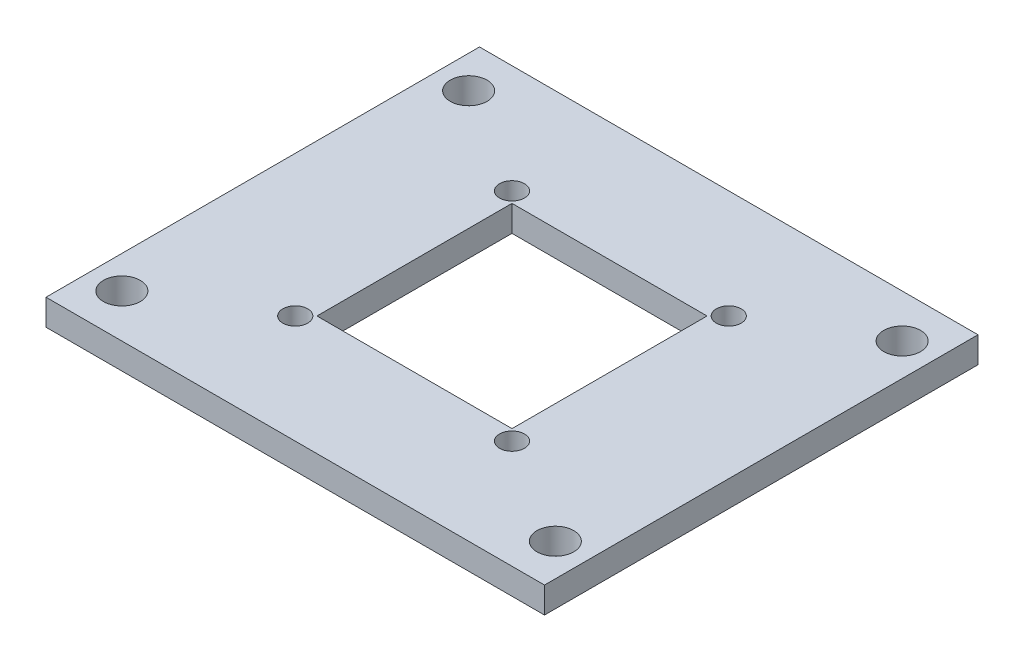
ISO-10303-21;
HEADER;
FILE_DESCRIPTION(('STEP AP214'),'2;1');
FILE_NAME('part.step','',(''),(''),'','','');
FILE_SCHEMA(('AUTOMOTIVE_DESIGN { 1 0 10303 214 1 1 1 1 }'));
ENDSEC;
DATA;
#1=APPLICATION_CONTEXT('core data for automotive mechanical design processes');
#2=APPLICATION_PROTOCOL_DEFINITION('international standard','automotive_design',2000,#1);
#3=PRODUCT_CONTEXT('',#1,'mechanical');
#4=PRODUCT('Part','Part','',(#3));
#5=PRODUCT_RELATED_PRODUCT_CATEGORY('part','',(#4));
#6=PRODUCT_DEFINITION_FORMATION('','',#4);
#7=PRODUCT_DEFINITION_CONTEXT('part definition',#1,'design');
#8=PRODUCT_DEFINITION('design','',#6,#7);
#9=PRODUCT_DEFINITION_SHAPE('','',#8);
#10=(LENGTH_UNIT() NAMED_UNIT(*) SI_UNIT(.MILLI.,.METRE.));
#11=(NAMED_UNIT(*) PLANE_ANGLE_UNIT() SI_UNIT($,.RADIAN.));
#12=(NAMED_UNIT(*) SI_UNIT($,.STERADIAN.) SOLID_ANGLE_UNIT());
#13=UNCERTAINTY_MEASURE_WITH_UNIT(LENGTH_MEASURE(1.E-05),#10,'distance_accuracy_value','');
#14=(GEOMETRIC_REPRESENTATION_CONTEXT(3) GLOBAL_UNCERTAINTY_ASSIGNED_CONTEXT((#13)) GLOBAL_UNIT_ASSIGNED_CONTEXT((#10,
#11,#12)) REPRESENTATION_CONTEXT('',''));
#15=CARTESIAN_POINT('',(0.,0.,0.));
#16=DIRECTION('',(0.,0.,1.));
#17=DIRECTION('',(1.,0.,0.));
#18=AXIS2_PLACEMENT_3D('',#15,#16,#17);
#19=CARTESIAN_POINT('',(20.,-20.,-17.));
#20=DIRECTION('',(0.,1.,0.));
#21=DIRECTION('',(1.,0.,0.));
#22=AXIS2_PLACEMENT_3D('',#19,#20,#21);
#23=CYLINDRICAL_SURFACE('',#22,1.7);
#24=CARTESIAN_POINT('',(20.,-22.,-17.));
#25=DIRECTION('',(0.,1.,0.));
#26=DIRECTION('',(1.,0.,0.));
#27=AXIS2_PLACEMENT_3D('',#24,#25,#26);
#28=CIRCLE('',#27,1.7);
#29=CARTESIAN_POINT('',(21.7,-22.,-17.));
#30=VERTEX_POINT('',#29);
#31=EDGE_CURVE('E304',#30,#30,#28,.T.);
#32=ORIENTED_EDGE('',*,*,#31,.T.);
#33=DIRECTION('',(0.,-1.,0.));
#34=VECTOR('',#33,1.);
#35=CARTESIAN_POINT('',(21.7,-20.,-17.));
#36=LINE('',#35,#34);
#37=CARTESIAN_POINT('',(21.7,-24.4,-17.));
#38=VERTEX_POINT('',#37);
#39=EDGE_CURVE('E9',#30,#38,#36,.T.);
#40=ORIENTED_EDGE('',*,*,#39,.T.);
#41=CARTESIAN_POINT('',(20.,-24.4,-17.));
#42=DIRECTION('',(0.,1.,0.));
#43=DIRECTION('',(1.,0.,0.));
#44=AXIS2_PLACEMENT_3D('',#41,#42,#43);
#45=CIRCLE('',#44,1.7);
#46=EDGE_CURVE('E237',#38,#38,#45,.T.);
#47=ORIENTED_EDGE('',*,*,#46,.F.);
#48=ORIENTED_EDGE('',*,*,#39,.F.);
#49=EDGE_LOOP('',(#32,#40,#47,#48));
#50=FACE_BOUND('',#49,.T.);
#51=ADVANCED_FACE('F15',(#50),#23,.F.);
#52=CARTESIAN_POINT('',(10.,-20.,-23.));
#53=DIRECTION('',(0.,1.,0.));
#54=DIRECTION('',(1.,0.,0.));
#55=AXIS2_PLACEMENT_3D('',#52,#53,#54);
#56=CYLINDRICAL_SURFACE('',#55,1.15);
#57=CARTESIAN_POINT('',(10.,-22.,-23.));
#58=DIRECTION('',(0.,1.,0.));
#59=DIRECTION('',(1.,0.,0.));
#60=AXIS2_PLACEMENT_3D('',#57,#58,#59);
#61=CIRCLE('',#60,1.15);
#62=CARTESIAN_POINT('',(11.15,-22.,-23.));
#63=VERTEX_POINT('',#62);
#64=EDGE_CURVE('E301',#63,#63,#61,.T.);
#65=ORIENTED_EDGE('',*,*,#64,.T.);
#66=DIRECTION('',(0.,-1.,0.));
#67=VECTOR('',#66,1.);
#68=CARTESIAN_POINT('',(11.15,-20.,-23.));
#69=LINE('',#68,#67);
#70=CARTESIAN_POINT('',(11.15,-24.4,-23.));
#71=VERTEX_POINT('',#70);
#72=EDGE_CURVE('E23',#63,#71,#69,.T.);
#73=ORIENTED_EDGE('',*,*,#72,.T.);
#74=CARTESIAN_POINT('',(10.,-24.4,-23.));
#75=DIRECTION('',(0.,1.,0.));
#76=DIRECTION('',(1.,0.,0.));
#77=AXIS2_PLACEMENT_3D('',#74,#75,#76);
#78=CIRCLE('',#77,1.15);
#79=EDGE_CURVE('E228',#71,#71,#78,.T.);
#80=ORIENTED_EDGE('',*,*,#79,.F.);
#81=ORIENTED_EDGE('',*,*,#72,.F.);
#82=EDGE_LOOP('',(#65,#73,#80,#81));
#83=FACE_BOUND('',#82,.T.);
#84=ADVANCED_FACE('F404',(#83),#56,.F.);
#85=CARTESIAN_POINT('',(20.,-20.,-49.));
#86=DIRECTION('',(0.,1.,0.));
#87=DIRECTION('',(1.,0.,0.));
#88=AXIS2_PLACEMENT_3D('',#85,#86,#87);
#89=CYLINDRICAL_SURFACE('',#88,1.7);
#90=CARTESIAN_POINT('',(20.,-22.,-49.));
#91=DIRECTION('',(0.,1.,0.));
#92=DIRECTION('',(1.,0.,0.));
#93=AXIS2_PLACEMENT_3D('',#90,#91,#92);
#94=CIRCLE('',#93,1.7);
#95=CARTESIAN_POINT('',(21.7,-22.,-49.));
#96=VERTEX_POINT('',#95);
#97=EDGE_CURVE('E297',#96,#96,#94,.T.);
#98=ORIENTED_EDGE('',*,*,#97,.T.);
#99=DIRECTION('',(0.,-1.,0.));
#100=VECTOR('',#99,1.);
#101=CARTESIAN_POINT('',(21.7,-20.,-49.));
#102=LINE('',#101,#100);
#103=CARTESIAN_POINT('',(21.7,-24.4,-49.));
#104=VERTEX_POINT('',#103);
#105=EDGE_CURVE('E209',#96,#104,#102,.T.);
#106=ORIENTED_EDGE('',*,*,#105,.T.);
#107=CARTESIAN_POINT('',(20.,-24.4,-49.));
#108=DIRECTION('',(0.,1.,0.));
#109=DIRECTION('',(1.,0.,0.));
#110=AXIS2_PLACEMENT_3D('',#107,#108,#109);
#111=CIRCLE('',#110,1.7);
#112=EDGE_CURVE('E224',#104,#104,#111,.T.);
#113=ORIENTED_EDGE('',*,*,#112,.F.);
#114=ORIENTED_EDGE('',*,*,#105,.F.);
#115=EDGE_LOOP('',(#98,#106,#113,#114));
#116=FACE_BOUND('',#115,.T.);
#117=ADVANCED_FACE('F408',(#116),#89,.F.);
#118=CARTESIAN_POINT('',(10.,-20.,-43.));
#119=DIRECTION('',(0.,1.,0.));
#120=DIRECTION('',(1.,0.,0.));
#121=AXIS2_PLACEMENT_3D('',#118,#119,#120);
#122=CYLINDRICAL_SURFACE('',#121,1.15);
#123=CARTESIAN_POINT('',(10.,-22.,-43.));
#124=DIRECTION('',(0.,1.,0.));
#125=DIRECTION('',(1.,0.,0.));
#126=AXIS2_PLACEMENT_3D('',#123,#124,#125);
#127=CIRCLE('',#126,1.15);
#128=CARTESIAN_POINT('',(11.15,-22.,-43.));
#129=VERTEX_POINT('',#128);
#130=EDGE_CURVE('E293',#129,#129,#127,.T.);
#131=ORIENTED_EDGE('',*,*,#130,.T.);
#132=DIRECTION('',(0.,-1.,0.));
#133=VECTOR('',#132,1.);
#134=CARTESIAN_POINT('',(11.15,-20.,-43.));
#135=LINE('',#134,#133);
#136=CARTESIAN_POINT('',(11.15,-24.4,-43.));
#137=VERTEX_POINT('',#136);
#138=EDGE_CURVE('E235',#129,#137,#135,.T.);
#139=ORIENTED_EDGE('',*,*,#138,.T.);
#140=CARTESIAN_POINT('',(10.,-24.4,-43.));
#141=DIRECTION('',(0.,1.,0.));
#142=DIRECTION('',(1.,0.,0.));
#143=AXIS2_PLACEMENT_3D('',#140,#141,#142);
#144=CIRCLE('',#143,1.15);
#145=EDGE_CURVE('E214',#137,#137,#144,.T.);
#146=ORIENTED_EDGE('',*,*,#145,.F.);
#147=ORIENTED_EDGE('',*,*,#138,.F.);
#148=EDGE_LOOP('',(#131,#139,#146,#147));
#149=FACE_BOUND('',#148,.T.);
#150=ADVANCED_FACE('F326',(#149),#122,.F.);
#151=CARTESIAN_POINT('',(-10.,-20.,-23.));
#152=DIRECTION('',(0.,1.,0.));
#153=DIRECTION('',(1.,0.,0.));
#154=AXIS2_PLACEMENT_3D('',#151,#152,#153);
#155=CYLINDRICAL_SURFACE('',#154,1.15);
#156=CARTESIAN_POINT('',(-10.,-22.,-23.));
#157=DIRECTION('',(0.,1.,0.));
#158=DIRECTION('',(1.,0.,0.));
#159=AXIS2_PLACEMENT_3D('',#156,#157,#158);
#160=CIRCLE('',#159,1.15);
#161=CARTESIAN_POINT('',(-8.85,-22.,-23.));
#162=VERTEX_POINT('',#161);
#163=EDGE_CURVE('E289',#162,#162,#160,.T.);
#164=ORIENTED_EDGE('',*,*,#163,.T.);
#165=DIRECTION('',(0.,-1.,0.));
#166=VECTOR('',#165,1.);
#167=CARTESIAN_POINT('',(-8.85,-20.,-23.));
#168=LINE('',#167,#166);
#169=CARTESIAN_POINT('',(-8.85,-24.4,-23.));
#170=VERTEX_POINT('',#169);
#171=EDGE_CURVE('E232',#162,#170,#168,.T.);
#172=ORIENTED_EDGE('',*,*,#171,.T.);
#173=CARTESIAN_POINT('',(-10.,-24.4,-23.));
#174=DIRECTION('',(0.,1.,0.));
#175=DIRECTION('',(1.,0.,0.));
#176=AXIS2_PLACEMENT_3D('',#173,#174,#175);
#177=CIRCLE('',#176,1.15);
#178=EDGE_CURVE('E210',#170,#170,#177,.T.);
#179=ORIENTED_EDGE('',*,*,#178,.F.);
#180=ORIENTED_EDGE('',*,*,#171,.F.);
#181=EDGE_LOOP('',(#164,#172,#179,#180));
#182=FACE_BOUND('',#181,.T.);
#183=ADVANCED_FACE('F424',(#182),#155,.F.);
#184=CARTESIAN_POINT('',(-20.,-20.,-17.));
#185=DIRECTION('',(0.,1.,0.));
#186=DIRECTION('',(1.,0.,0.));
#187=AXIS2_PLACEMENT_3D('',#184,#185,#186);
#188=CYLINDRICAL_SURFACE('',#187,1.7);
#189=CARTESIAN_POINT('',(-20.,-22.,-17.));
#190=DIRECTION('',(0.,1.,0.));
#191=DIRECTION('',(1.,0.,0.));
#192=AXIS2_PLACEMENT_3D('',#189,#190,#191);
#193=CIRCLE('',#192,1.7);
#194=CARTESIAN_POINT('',(-18.3,-22.,-17.));
#195=VERTEX_POINT('',#194);
#196=EDGE_CURVE('E285',#195,#195,#193,.T.);
#197=ORIENTED_EDGE('',*,*,#196,.T.);
#198=DIRECTION('',(0.,-1.,0.));
#199=VECTOR('',#198,1.);
#200=CARTESIAN_POINT('',(-18.3,-20.,-17.));
#201=LINE('',#200,#199);
#202=CARTESIAN_POINT('',(-18.3,-24.4,-17.));
#203=VERTEX_POINT('',#202);
#204=EDGE_CURVE('E236',#195,#203,#201,.T.);
#205=ORIENTED_EDGE('',*,*,#204,.T.);
#206=CARTESIAN_POINT('',(-20.,-24.4,-17.));
#207=DIRECTION('',(0.,1.,0.));
#208=DIRECTION('',(1.,0.,0.));
#209=AXIS2_PLACEMENT_3D('',#206,#207,#208);
#210=CIRCLE('',#209,1.7);
#211=EDGE_CURVE('E215',#203,#203,#210,.T.);
#212=ORIENTED_EDGE('',*,*,#211,.F.);
#213=ORIENTED_EDGE('',*,*,#204,.F.);
#214=EDGE_LOOP('',(#197,#205,#212,#213));
#215=FACE_BOUND('',#214,.T.);
#216=ADVANCED_FACE('F422',(#215),#188,.F.);
#217=CARTESIAN_POINT('',(-9.,-25.2,-42.));
#218=DIRECTION('',(0.,0.,1.));
#219=DIRECTION('',(1.,0.,0.));
#220=AXIS2_PLACEMENT_3D('',#217,#218,#219);
#221=PLANE('',#220);
#222=DIRECTION('',(0.,1.,0.));
#223=VECTOR('',#222,1.);
#224=CARTESIAN_POINT('',(-9.,-25.2,-42.));
#225=LINE('',#224,#223);
#226=CARTESIAN_POINT('',(-9.,-24.4,-42.));
#227=VERTEX_POINT('',#226);
#228=CARTESIAN_POINT('',(-9.,-22.,-42.));
#229=VERTEX_POINT('',#228);
#230=EDGE_CURVE('E163',#227,#229,#225,.T.);
#231=ORIENTED_EDGE('',*,*,#230,.F.);
#232=DIRECTION('',(1.,0.,0.));
#233=VECTOR('',#232,1.);
#234=CARTESIAN_POINT('',(-16.,-24.4,-42.));
#235=LINE('',#234,#233);
#236=CARTESIAN_POINT('',(9.,-24.4,-42.));
#237=VERTEX_POINT('',#236);
#238=EDGE_CURVE('E167',#227,#237,#235,.T.);
#239=ORIENTED_EDGE('',*,*,#238,.T.);
#240=DIRECTION('',(0.,1.,0.));
#241=VECTOR('',#240,1.);
#242=CARTESIAN_POINT('',(9.,-25.2,-42.));
#243=LINE('',#242,#241);
#244=CARTESIAN_POINT('',(9.,-22.,-42.));
#245=VERTEX_POINT('',#244);
#246=EDGE_CURVE('E175',#237,#245,#243,.T.);
#247=ORIENTED_EDGE('',*,*,#246,.T.);
#248=DIRECTION('',(1.,0.,0.));
#249=VECTOR('',#248,1.);
#250=CARTESIAN_POINT('',(-16.,-22.,-42.));
#251=LINE('',#250,#249);
#252=EDGE_CURVE('E170',#229,#245,#251,.T.);
#253=ORIENTED_EDGE('',*,*,#252,.F.);
#254=EDGE_LOOP('',(#231,#239,#247,#253));
#255=FACE_BOUND('',#254,.T.);
#256=ADVANCED_FACE('F165',(#255),#221,.T.);
#257=CARTESIAN_POINT('',(9.,-25.2,-42.));
#258=DIRECTION('',(1.,0.,0.));
#259=DIRECTION('',(0.,1.,0.));
#260=AXIS2_PLACEMENT_3D('',#257,#258,#259);
#261=PLANE('',#260);
#262=DIRECTION('',(0.,0.,-1.));
#263=VECTOR('',#262,1.);
#264=CARTESIAN_POINT('',(9.,-22.,-47.5));
#265=LINE('',#264,#263);
#266=CARTESIAN_POINT('',(9.,-22.,-24.));
#267=VERTEX_POINT('',#266);
#268=EDGE_CURVE('E281',#267,#245,#265,.T.);
#269=ORIENTED_EDGE('',*,*,#268,.T.);
#270=ORIENTED_EDGE('',*,*,#246,.F.);
#271=DIRECTION('',(0.,0.,-1.));
#272=VECTOR('',#271,1.);
#273=CARTESIAN_POINT('',(9.,-24.4,-47.5));
#274=LINE('',#273,#272);
#275=CARTESIAN_POINT('',(9.,-24.4,-24.));
#276=VERTEX_POINT('',#275);
#277=EDGE_CURVE('E190',#276,#237,#274,.T.);
#278=ORIENTED_EDGE('',*,*,#277,.F.);
#279=DIRECTION('',(0.,1.,0.));
#280=VECTOR('',#279,1.);
#281=CARTESIAN_POINT('',(9.,-25.2,-24.));
#282=LINE('',#281,#280);
#283=EDGE_CURVE('E316',#276,#267,#282,.T.);
#284=ORIENTED_EDGE('',*,*,#283,.T.);
#285=EDGE_LOOP('',(#269,#270,#278,#284));
#286=FACE_BOUND('',#285,.T.);
#287=ADVANCED_FACE('F368',(#286),#261,.F.);
#288=CARTESIAN_POINT('',(-9.,-25.2,-42.));
#289=DIRECTION('',(1.,0.,0.));
#290=DIRECTION('',(0.,1.,0.));
#291=AXIS2_PLACEMENT_3D('',#288,#289,#290);
#292=PLANE('',#291);
#293=DIRECTION('',(0.,1.,0.));
#294=VECTOR('',#293,1.);
#295=CARTESIAN_POINT('',(-9.,-25.2,-24.));
#296=LINE('',#295,#294);
#297=CARTESIAN_POINT('',(-9.,-24.4,-24.));
#298=VERTEX_POINT('',#297);
#299=CARTESIAN_POINT('',(-9.,-22.,-24.));
#300=VERTEX_POINT('',#299);
#301=EDGE_CURVE('E176',#298,#300,#296,.T.);
#302=ORIENTED_EDGE('',*,*,#301,.F.);
#303=DIRECTION('',(0.,0.,-1.));
#304=VECTOR('',#303,1.);
#305=CARTESIAN_POINT('',(-9.,-24.4,-47.5));
#306=LINE('',#305,#304);
#307=EDGE_CURVE('E179',#298,#227,#306,.T.);
#308=ORIENTED_EDGE('',*,*,#307,.T.);
#309=ORIENTED_EDGE('',*,*,#230,.T.);
#310=DIRECTION('',(0.,0.,-1.));
#311=VECTOR('',#310,1.);
#312=CARTESIAN_POINT('',(-9.,-22.,-47.5));
#313=LINE('',#312,#311);
#314=EDGE_CURVE('E276',#300,#229,#313,.T.);
#315=ORIENTED_EDGE('',*,*,#314,.F.);
#316=EDGE_LOOP('',(#302,#308,#309,#315));
#317=FACE_BOUND('',#316,.T.);
#318=ADVANCED_FACE('F180',(#317),#292,.T.);
#319=CARTESIAN_POINT('',(-9.,-25.2,-24.));
#320=DIRECTION('',(0.,0.,1.));
#321=DIRECTION('',(1.,0.,0.));
#322=AXIS2_PLACEMENT_3D('',#319,#320,#321);
#323=PLANE('',#322);
#324=DIRECTION('',(1.,0.,0.));
#325=VECTOR('',#324,1.);
#326=CARTESIAN_POINT('',(-16.,-22.,-24.));
#327=LINE('',#326,#325);
#328=EDGE_CURVE('E275',#300,#267,#327,.T.);
#329=ORIENTED_EDGE('',*,*,#328,.T.);
#330=ORIENTED_EDGE('',*,*,#283,.F.);
#331=DIRECTION('',(1.,0.,0.));
#332=VECTOR('',#331,1.);
#333=CARTESIAN_POINT('',(-16.,-24.4,-24.));
#334=LINE('',#333,#332);
#335=EDGE_CURVE('E185',#298,#276,#334,.T.);
#336=ORIENTED_EDGE('',*,*,#335,.F.);
#337=ORIENTED_EDGE('',*,*,#301,.T.);
#338=EDGE_LOOP('',(#329,#330,#336,#337));
#339=FACE_BOUND('',#338,.T.);
#340=ADVANCED_FACE('F362',(#339),#323,.F.);
#341=CARTESIAN_POINT('',(-10.,-20.,-43.));
#342=DIRECTION('',(0.,1.,0.));
#343=DIRECTION('',(1.,0.,0.));
#344=AXIS2_PLACEMENT_3D('',#341,#342,#343);
#345=CYLINDRICAL_SURFACE('',#344,1.15);
#346=CARTESIAN_POINT('',(-10.,-22.,-43.));
#347=DIRECTION('',(0.,1.,0.));
#348=DIRECTION('',(1.,0.,0.));
#349=AXIS2_PLACEMENT_3D('',#346,#347,#348);
#350=CIRCLE('',#349,1.15);
#351=CARTESIAN_POINT('',(-8.85,-22.,-43.));
#352=VERTEX_POINT('',#351);
#353=EDGE_CURVE('E269',#352,#352,#350,.T.);
#354=ORIENTED_EDGE('',*,*,#353,.T.);
#355=DIRECTION('',(0.,-1.,0.));
#356=VECTOR('',#355,1.);
#357=CARTESIAN_POINT('',(-8.85,-20.,-43.));
#358=LINE('',#357,#356);
#359=CARTESIAN_POINT('',(-8.85,-24.4,-43.));
#360=VERTEX_POINT('',#359);
#361=EDGE_CURVE('E313',#352,#360,#358,.T.);
#362=ORIENTED_EDGE('',*,*,#361,.T.);
#363=CARTESIAN_POINT('',(-10.,-24.4,-43.));
#364=DIRECTION('',(0.,1.,0.));
#365=DIRECTION('',(1.,0.,0.));
#366=AXIS2_PLACEMENT_3D('',#363,#364,#365);
#367=CIRCLE('',#366,1.15);
#368=EDGE_CURVE('E197',#360,#360,#367,.T.);
#369=ORIENTED_EDGE('',*,*,#368,.F.);
#370=ORIENTED_EDGE('',*,*,#361,.F.);
#371=EDGE_LOOP('',(#354,#362,#369,#370));
#372=FACE_BOUND('',#371,.T.);
#373=ADVANCED_FACE('F400',(#372),#345,.F.);
#374=CARTESIAN_POINT('',(-20.,-20.,-49.));
#375=DIRECTION('',(0.,1.,0.));
#376=DIRECTION('',(1.,0.,0.));
#377=AXIS2_PLACEMENT_3D('',#374,#375,#376);
#378=CYLINDRICAL_SURFACE('',#377,1.7);
#379=CARTESIAN_POINT('',(-20.,-22.,-49.));
#380=DIRECTION('',(0.,1.,0.));
#381=DIRECTION('',(1.,0.,0.));
#382=AXIS2_PLACEMENT_3D('',#379,#380,#381);
#383=CIRCLE('',#382,1.7);
#384=CARTESIAN_POINT('',(-18.3,-22.,-49.));
#385=VERTEX_POINT('',#384);
#386=EDGE_CURVE('E265',#385,#385,#383,.T.);
#387=ORIENTED_EDGE('',*,*,#386,.T.);
#388=DIRECTION('',(0.,-1.,0.));
#389=VECTOR('',#388,1.);
#390=CARTESIAN_POINT('',(-18.3,-20.,-49.));
#391=LINE('',#390,#389);
#392=CARTESIAN_POINT('',(-18.3,-24.4,-49.));
#393=VERTEX_POINT('',#392);
#394=EDGE_CURVE('E310',#385,#393,#391,.T.);
#395=ORIENTED_EDGE('',*,*,#394,.T.);
#396=CARTESIAN_POINT('',(-20.,-24.4,-49.));
#397=DIRECTION('',(0.,1.,0.));
#398=DIRECTION('',(1.,0.,0.));
#399=AXIS2_PLACEMENT_3D('',#396,#397,#398);
#400=CIRCLE('',#399,1.7);
#401=EDGE_CURVE('E223',#393,#393,#400,.T.);
#402=ORIENTED_EDGE('',*,*,#401,.F.);
#403=ORIENTED_EDGE('',*,*,#394,.F.);
#404=EDGE_LOOP('',(#387,#395,#402,#403));
#405=FACE_BOUND('',#404,.T.);
#406=ADVANCED_FACE('F392',(#405),#378,.F.);
#407=CARTESIAN_POINT('',(23.,-24.4,-53.));
#408=DIRECTION('',(1.,0.,0.));
#409=DIRECTION('',(0.,1.,0.));
#410=AXIS2_PLACEMENT_3D('',#407,#408,#409);
#411=PLANE('',#410);
#412=DIRECTION('',(0.,0.,1.));
#413=VECTOR('',#412,1.);
#414=CARTESIAN_POINT('',(23.,-24.4,-53.));
#415=LINE('',#414,#413);
#416=CARTESIAN_POINT('',(23.,-24.4,-53.));
#417=VERTEX_POINT('',#416);
#418=CARTESIAN_POINT('',(23.,-24.4,-13.));
#419=VERTEX_POINT('',#418);
#420=EDGE_CURVE('E203',#417,#419,#415,.T.);
#421=ORIENTED_EDGE('',*,*,#420,.F.);
#422=DIRECTION('',(0.,1.,0.));
#423=VECTOR('',#422,1.);
#424=CARTESIAN_POINT('',(23.,-24.4,-53.));
#425=LINE('',#424,#423);
#426=CARTESIAN_POINT('',(23.,-22.,-53.));
#427=VERTEX_POINT('',#426);
#428=EDGE_CURVE('E307',#417,#427,#425,.T.);
#429=ORIENTED_EDGE('',*,*,#428,.T.);
#430=DIRECTION('',(0.,0.,1.));
#431=VECTOR('',#430,1.);
#432=CARTESIAN_POINT('',(23.,-22.,-53.));
#433=LINE('',#432,#431);
#434=CARTESIAN_POINT('',(23.,-22.,-13.));
#435=VERTEX_POINT('',#434);
#436=EDGE_CURVE('E264',#427,#435,#433,.T.);
#437=ORIENTED_EDGE('',*,*,#436,.T.);
#438=DIRECTION('',(0.,1.,0.));
#439=VECTOR('',#438,1.);
#440=CARTESIAN_POINT('',(23.,-24.4,-13.));
#441=LINE('',#440,#439);
#442=EDGE_CURVE('E241',#419,#435,#441,.T.);
#443=ORIENTED_EDGE('',*,*,#442,.F.);
#444=EDGE_LOOP('',(#421,#429,#437,#443));
#445=FACE_BOUND('',#444,.T.);
#446=ADVANCED_FACE('F390',(#445),#411,.T.);
#447=CARTESIAN_POINT('',(-23.,-24.4,-53.));
#448=DIRECTION('',(0.,0.,1.));
#449=DIRECTION('',(1.,0.,0.));
#450=AXIS2_PLACEMENT_3D('',#447,#448,#449);
#451=PLANE('',#450);
#452=DIRECTION('',(1.,0.,0.));
#453=VECTOR('',#452,1.);
#454=CARTESIAN_POINT('',(-23.,-22.,-53.));
#455=LINE('',#454,#453);
#456=CARTESIAN_POINT('',(-23.,-22.,-53.));
#457=VERTEX_POINT('',#456);
#458=EDGE_CURVE('E260',#457,#427,#455,.T.);
#459=ORIENTED_EDGE('',*,*,#458,.T.);
#460=ORIENTED_EDGE('',*,*,#428,.F.);
#461=DIRECTION('',(1.,0.,0.));
#462=VECTOR('',#461,1.);
#463=CARTESIAN_POINT('',(-23.,-24.4,-53.));
#464=LINE('',#463,#462);
#465=CARTESIAN_POINT('',(-23.,-24.4,-53.));
#466=VERTEX_POINT('',#465);
#467=EDGE_CURVE('E219',#466,#417,#464,.T.);
#468=ORIENTED_EDGE('',*,*,#467,.F.);
#469=DIRECTION('',(0.,1.,0.));
#470=VECTOR('',#469,1.);
#471=CARTESIAN_POINT('',(-23.,-24.4,-53.));
#472=LINE('',#471,#470);
#473=EDGE_CURVE('E351',#466,#457,#472,.T.);
#474=ORIENTED_EDGE('',*,*,#473,.T.);
#475=EDGE_LOOP('',(#459,#460,#468,#474));
#476=FACE_BOUND('',#475,.T.);
#477=ADVANCED_FACE('F385',(#476),#451,.F.);
#478=CARTESIAN_POINT('',(-23.,-22.,-53.));
#479=DIRECTION('',(0.,1.,0.));
#480=DIRECTION('',(1.,0.,0.));
#481=AXIS2_PLACEMENT_3D('',#478,#479,#480);
#482=PLANE('',#481);
#483=ORIENTED_EDGE('',*,*,#31,.F.);
#484=EDGE_LOOP('',(#483));
#485=FACE_BOUND('',#484,.T.);
#486=ORIENTED_EDGE('',*,*,#64,.F.);
#487=EDGE_LOOP('',(#486));
#488=FACE_BOUND('',#487,.T.);
#489=ORIENTED_EDGE('',*,*,#97,.F.);
#490=EDGE_LOOP('',(#489));
#491=FACE_BOUND('',#490,.T.);
#492=ORIENTED_EDGE('',*,*,#130,.F.);
#493=EDGE_LOOP('',(#492));
#494=FACE_BOUND('',#493,.T.);
#495=ORIENTED_EDGE('',*,*,#163,.F.);
#496=EDGE_LOOP('',(#495));
#497=FACE_BOUND('',#496,.T.);
#498=ORIENTED_EDGE('',*,*,#196,.F.);
#499=EDGE_LOOP('',(#498));
#500=FACE_BOUND('',#499,.T.);
#501=ORIENTED_EDGE('',*,*,#328,.F.);
#502=ORIENTED_EDGE('',*,*,#314,.T.);
#503=ORIENTED_EDGE('',*,*,#252,.T.);
#504=ORIENTED_EDGE('',*,*,#268,.F.);
#505=EDGE_LOOP('',(#501,#502,#503,#504));
#506=FACE_BOUND('',#505,.T.);
#507=ORIENTED_EDGE('',*,*,#353,.F.);
#508=EDGE_LOOP('',(#507));
#509=FACE_BOUND('',#508,.T.);
#510=ORIENTED_EDGE('',*,*,#386,.F.);
#511=EDGE_LOOP('',(#510));
#512=FACE_BOUND('',#511,.T.);
#513=ORIENTED_EDGE('',*,*,#458,.F.);
#514=DIRECTION('',(0.,0.,1.));
#515=VECTOR('',#514,1.);
#516=CARTESIAN_POINT('',(-23.,-22.,-53.));
#517=LINE('',#516,#515);
#518=CARTESIAN_POINT('',(-23.,-22.,-13.));
#519=VERTEX_POINT('',#518);
#520=EDGE_CURVE('E348',#457,#519,#517,.T.);
#521=ORIENTED_EDGE('',*,*,#520,.T.);
#522=DIRECTION('',(1.,0.,0.));
#523=VECTOR('',#522,1.);
#524=CARTESIAN_POINT('',(-23.,-22.,-13.));
#525=LINE('',#524,#523);
#526=EDGE_CURVE('E256',#519,#435,#525,.T.);
#527=ORIENTED_EDGE('',*,*,#526,.T.);
#528=ORIENTED_EDGE('',*,*,#436,.F.);
#529=EDGE_LOOP('',(#513,#521,#527,#528));
#530=FACE_BOUND('',#529,.T.);
#531=ADVANCED_FACE('F365',(#485,#488,#491,#494,#497,#500,#506,#509,#512,#530),#482,.T.);
#532=CARTESIAN_POINT('',(-23.,-24.4,-13.));
#533=DIRECTION('',(0.,0.,1.));
#534=DIRECTION('',(1.,0.,0.));
#535=AXIS2_PLACEMENT_3D('',#532,#533,#534);
#536=PLANE('',#535);
#537=DIRECTION('',(0.,1.,0.));
#538=VECTOR('',#537,1.);
#539=CARTESIAN_POINT('',(-23.,-24.4,-13.));
#540=LINE('',#539,#538);
#541=CARTESIAN_POINT('',(-23.,-24.4,-13.));
#542=VERTEX_POINT('',#541);
#543=EDGE_CURVE('E352',#542,#519,#540,.T.);
#544=ORIENTED_EDGE('',*,*,#543,.F.);
#545=DIRECTION('',(1.,0.,0.));
#546=VECTOR('',#545,1.);
#547=CARTESIAN_POINT('',(-23.,-24.4,-13.));
#548=LINE('',#547,#546);
#549=EDGE_CURVE('E206',#542,#419,#548,.T.);
#550=ORIENTED_EDGE('',*,*,#549,.T.);
#551=ORIENTED_EDGE('',*,*,#442,.T.);
#552=ORIENTED_EDGE('',*,*,#526,.F.);
#553=EDGE_LOOP('',(#544,#550,#551,#552));
#554=FACE_BOUND('',#553,.T.);
#555=ADVANCED_FACE('F332',(#554),#536,.T.);
#556=CARTESIAN_POINT('',(-23.,-24.4,-53.));
#557=DIRECTION('',(0.,1.,0.));
#558=DIRECTION('',(1.,0.,0.));
#559=AXIS2_PLACEMENT_3D('',#556,#557,#558);
#560=PLANE('',#559);
#561=ORIENTED_EDGE('',*,*,#46,.T.);
#562=EDGE_LOOP('',(#561));
#563=FACE_BOUND('',#562,.T.);
#564=ORIENTED_EDGE('',*,*,#79,.T.);
#565=EDGE_LOOP('',(#564));
#566=FACE_BOUND('',#565,.T.);
#567=ORIENTED_EDGE('',*,*,#112,.T.);
#568=EDGE_LOOP('',(#567));
#569=FACE_BOUND('',#568,.T.);
#570=ORIENTED_EDGE('',*,*,#145,.T.);
#571=EDGE_LOOP('',(#570));
#572=FACE_BOUND('',#571,.T.);
#573=ORIENTED_EDGE('',*,*,#178,.T.);
#574=EDGE_LOOP('',(#573));
#575=FACE_BOUND('',#574,.T.);
#576=ORIENTED_EDGE('',*,*,#211,.T.);
#577=EDGE_LOOP('',(#576));
#578=FACE_BOUND('',#577,.T.);
#579=ORIENTED_EDGE('',*,*,#277,.T.);
#580=ORIENTED_EDGE('',*,*,#238,.F.);
#581=ORIENTED_EDGE('',*,*,#307,.F.);
#582=ORIENTED_EDGE('',*,*,#335,.T.);
#583=EDGE_LOOP('',(#579,#580,#581,#582));
#584=FACE_BOUND('',#583,.T.);
#585=ORIENTED_EDGE('',*,*,#368,.T.);
#586=EDGE_LOOP('',(#585));
#587=FACE_BOUND('',#586,.T.);
#588=ORIENTED_EDGE('',*,*,#401,.T.);
#589=EDGE_LOOP('',(#588));
#590=FACE_BOUND('',#589,.T.);
#591=ORIENTED_EDGE('',*,*,#420,.T.);
#592=ORIENTED_EDGE('',*,*,#549,.F.);
#593=DIRECTION('',(0.,0.,1.));
#594=VECTOR('',#593,1.);
#595=CARTESIAN_POINT('',(-23.,-24.4,-53.));
#596=LINE('',#595,#594);
#597=EDGE_CURVE('E201',#466,#542,#596,.T.);
#598=ORIENTED_EDGE('',*,*,#597,.F.);
#599=ORIENTED_EDGE('',*,*,#467,.T.);
#600=EDGE_LOOP('',(#591,#592,#598,#599));
#601=FACE_BOUND('',#600,.T.);
#602=ADVANCED_FACE('F187',(#563,#566,#569,#572,#575,#578,#584,#587,#590,#601),#560,.F.);
#603=CARTESIAN_POINT('',(-23.,-24.4,-53.));
#604=DIRECTION('',(1.,0.,0.));
#605=DIRECTION('',(0.,1.,0.));
#606=AXIS2_PLACEMENT_3D('',#603,#604,#605);
#607=PLANE('',#606);
#608=ORIENTED_EDGE('',*,*,#543,.T.);
#609=ORIENTED_EDGE('',*,*,#520,.F.);
#610=ORIENTED_EDGE('',*,*,#473,.F.);
#611=ORIENTED_EDGE('',*,*,#597,.T.);
#612=EDGE_LOOP('',(#608,#609,#610,#611));
#613=FACE_BOUND('',#612,.T.);
#614=ADVANCED_FACE('F331',(#613),#607,.F.);
#615=CLOSED_SHELL('',(#51,#84,#117,#150,#183,#216,#256,#287,#318,#340,#373,#406,#446,#477,#531,
#555,#602,#614));
#616=MANIFOLD_SOLID_BREP('B1',#615);
#617=ADVANCED_BREP_SHAPE_REPRESENTATION('',(#18,#616),#14);
#618=SHAPE_DEFINITION_REPRESENTATION(#9,#617);
ENDSEC;
END-ISO-10303-21;
